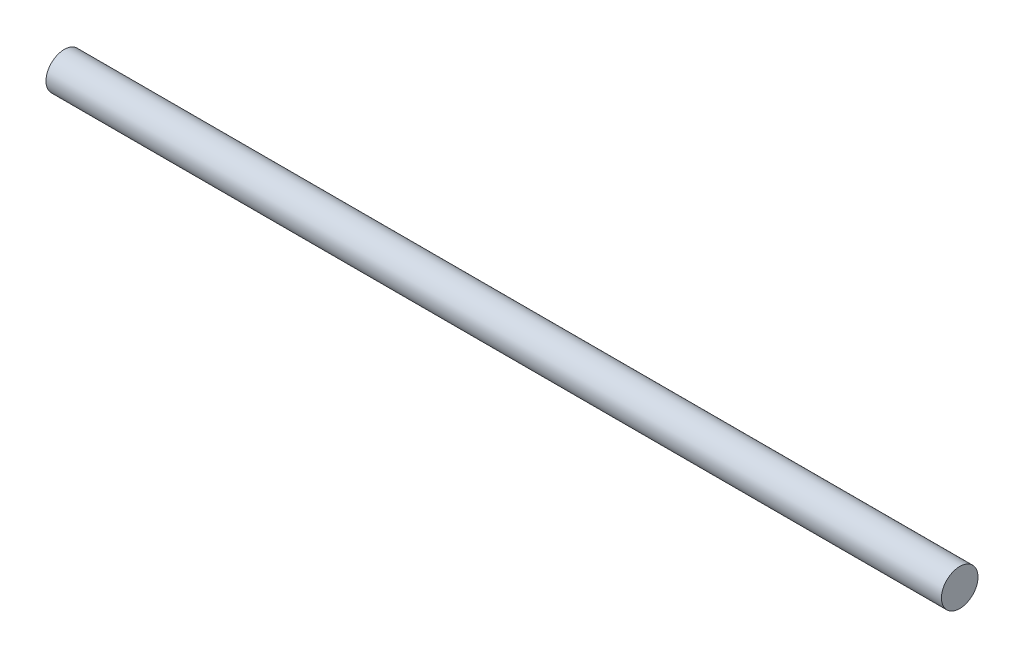
ISO-10303-21;
HEADER;
FILE_DESCRIPTION(('STEP AP214'),'2;1');
FILE_NAME('part.step','',(''),(''),'','','');
FILE_SCHEMA(('AUTOMOTIVE_DESIGN { 1 0 10303 214 1 1 1 1 }'));
ENDSEC;
DATA;
#1=APPLICATION_CONTEXT('core data for automotive mechanical design processes');
#2=APPLICATION_PROTOCOL_DEFINITION('international standard','automotive_design',2000,#1);
#3=PRODUCT_CONTEXT('',#1,'mechanical');
#4=PRODUCT('Part','Part','',(#3));
#5=PRODUCT_RELATED_PRODUCT_CATEGORY('part','',(#4));
#6=PRODUCT_DEFINITION_FORMATION('','',#4);
#7=PRODUCT_DEFINITION_CONTEXT('part definition',#1,'design');
#8=PRODUCT_DEFINITION('design','',#6,#7);
#9=PRODUCT_DEFINITION_SHAPE('','',#8);
#10=(LENGTH_UNIT() NAMED_UNIT(*) SI_UNIT(.MILLI.,.METRE.));
#11=(NAMED_UNIT(*) PLANE_ANGLE_UNIT() SI_UNIT($,.RADIAN.));
#12=(NAMED_UNIT(*) SI_UNIT($,.STERADIAN.) SOLID_ANGLE_UNIT());
#13=UNCERTAINTY_MEASURE_WITH_UNIT(LENGTH_MEASURE(1.E-05),#10,'distance_accuracy_value','');
#14=(GEOMETRIC_REPRESENTATION_CONTEXT(3) GLOBAL_UNCERTAINTY_ASSIGNED_CONTEXT((#13)) GLOBAL_UNIT_ASSIGNED_CONTEXT((#10,
#11,#12)) REPRESENTATION_CONTEXT('',''));
#15=CARTESIAN_POINT('',(0.,0.,0.));
#16=DIRECTION('',(0.,0.,1.));
#17=DIRECTION('',(1.,0.,0.));
#18=AXIS2_PLACEMENT_3D('',#15,#16,#17);
#19=CARTESIAN_POINT('',(220.5,0.,0.));
#20=DIRECTION('',(-1.,0.,0.));
#21=DIRECTION('',(0.,0.,1.));
#22=AXIS2_PLACEMENT_3D('',#19,#20,#21);
#23=CYLINDRICAL_SURFACE('',#22,9.);
#24=CARTESIAN_POINT('',(220.5,0.,0.));
#25=DIRECTION('',(1.,0.,0.));
#26=DIRECTION('',(0.,0.,-1.));
#27=AXIS2_PLACEMENT_3D('',#24,#25,#26);
#28=CIRCLE('',#27,9.);
#29=CARTESIAN_POINT('',(220.5,0.,-9.));
#30=VERTEX_POINT('',#29);
#31=EDGE_CURVE('E10',#30,#30,#28,.T.);
#32=ORIENTED_EDGE('',*,*,#31,.F.);
#33=EDGE_LOOP('',(#32));
#34=FACE_BOUND('',#33,.T.);
#35=CARTESIAN_POINT('',(-220.5,0.,0.));
#36=DIRECTION('',(1.,0.,0.));
#37=DIRECTION('',(0.,0.,-1.));
#38=AXIS2_PLACEMENT_3D('',#35,#36,#37);
#39=CIRCLE('',#38,9.);
#40=CARTESIAN_POINT('',(-220.5,0.,-9.));
#41=VERTEX_POINT('',#40);
#42=EDGE_CURVE('E34',#41,#41,#39,.T.);
#43=ORIENTED_EDGE('',*,*,#42,.T.);
#44=EDGE_LOOP('',(#43));
#45=FACE_BOUND('',#44,.T.);
#46=ADVANCED_FACE('F31',(#34,#45),#23,.T.);
#47=CARTESIAN_POINT('',(220.5,0.,0.));
#48=DIRECTION('',(1.,0.,0.));
#49=DIRECTION('',(0.,0.,-1.));
#50=AXIS2_PLACEMENT_3D('',#47,#48,#49);
#51=PLANE('',#50);
#52=ORIENTED_EDGE('',*,*,#31,.T.);
#53=EDGE_LOOP('',(#52));
#54=FACE_BOUND('',#53,.T.);
#55=ADVANCED_FACE('F46',(#54),#51,.T.);
#56=CARTESIAN_POINT('',(-220.5,0.,0.));
#57=DIRECTION('',(1.,0.,0.));
#58=DIRECTION('',(0.,0.,-1.));
#59=AXIS2_PLACEMENT_3D('',#56,#57,#58);
#60=PLANE('',#59);
#61=ORIENTED_EDGE('',*,*,#42,.F.);
#62=EDGE_LOOP('',(#61));
#63=FACE_BOUND('',#62,.T.);
#64=ADVANCED_FACE('F44',(#63),#60,.F.);
#65=CLOSED_SHELL('',(#46,#55,#64));
#66=MANIFOLD_SOLID_BREP('B2',#65);
#67=ADVANCED_BREP_SHAPE_REPRESENTATION('',(#18,#66),#14);
#68=SHAPE_DEFINITION_REPRESENTATION(#9,#67);
ENDSEC;
END-ISO-10303-21;
